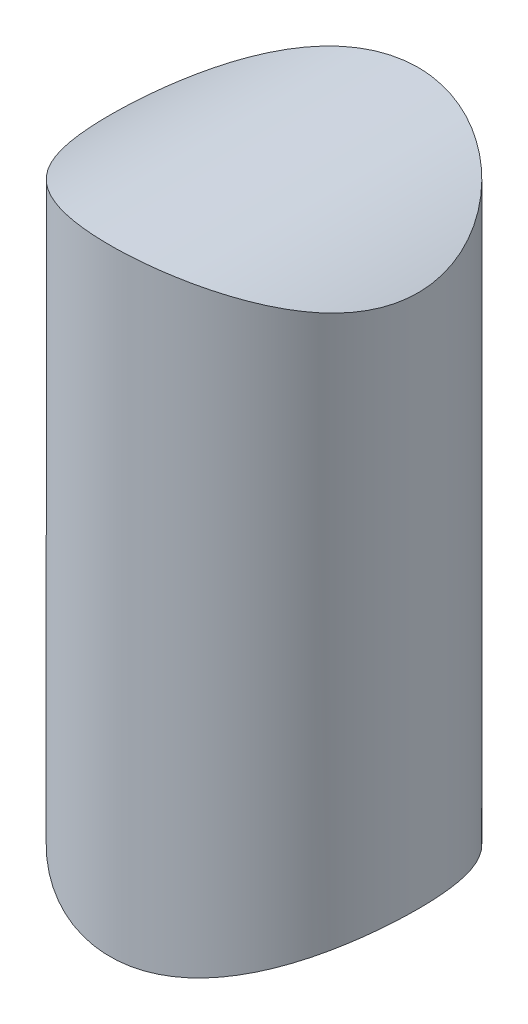
ISO-10303-21;
HEADER;
FILE_DESCRIPTION(('STEP AP214'),'2;1');
FILE_NAME('part.step','',(''),(''),'','','');
FILE_SCHEMA(('AUTOMOTIVE_DESIGN { 1 0 10303 214 1 1 1 1 }'));
ENDSEC;
DATA;
#1=APPLICATION_CONTEXT('core data for automotive mechanical design processes');
#2=APPLICATION_PROTOCOL_DEFINITION('international standard','automotive_design',2000,#1);
#3=PRODUCT_CONTEXT('',#1,'mechanical');
#4=PRODUCT('Part','Part','',(#3));
#5=PRODUCT_RELATED_PRODUCT_CATEGORY('part','',(#4));
#6=PRODUCT_DEFINITION_FORMATION('','',#4);
#7=PRODUCT_DEFINITION_CONTEXT('part definition',#1,'design');
#8=PRODUCT_DEFINITION('design','',#6,#7);
#9=PRODUCT_DEFINITION_SHAPE('','',#8);
#10=(LENGTH_UNIT() NAMED_UNIT(*) SI_UNIT(.MILLI.,.METRE.));
#11=(NAMED_UNIT(*) PLANE_ANGLE_UNIT() SI_UNIT($,.RADIAN.));
#12=(NAMED_UNIT(*) SI_UNIT($,.STERADIAN.) SOLID_ANGLE_UNIT());
#13=UNCERTAINTY_MEASURE_WITH_UNIT(LENGTH_MEASURE(1.E-05),#10,'distance_accuracy_value','');
#14=(GEOMETRIC_REPRESENTATION_CONTEXT(3) GLOBAL_UNCERTAINTY_ASSIGNED_CONTEXT((#13)) GLOBAL_UNIT_ASSIGNED_CONTEXT((#10,
#11,#12)) REPRESENTATION_CONTEXT('',''));
#15=CARTESIAN_POINT('',(0.,0.,0.));
#16=DIRECTION('',(0.,0.,1.));
#17=DIRECTION('',(1.,0.,0.));
#18=AXIS2_PLACEMENT_3D('',#15,#16,#17);
#19=CARTESIAN_POINT('',(0.,20.,0.));
#20=DIRECTION('',(0.,-1.,0.));
#21=DIRECTION('',(0.,0.,-1.));
#22=AXIS2_PLACEMENT_3D('',#19,#20,#21);
#23=CYLINDRICAL_SURFACE('',#22,2.);
#24=CARTESIAN_POINT('',(0.,6.91284167721457,-2.));
#25=CARTESIAN_POINT('',(0.105143925902467,6.91284740911374,-1.99999339536562));
#26=CARTESIAN_POINT('',(0.210413199395125,6.91703185681944,-1.99165985375789));
#27=CARTESIAN_POINT('',(0.417840470537792,6.93335855647143,-1.95869423931692));
#28=CARTESIAN_POINT('',(0.519992173427259,6.94551592063618,-1.93403121400437));
#29=CARTESIAN_POINT('',(0.717867089760898,6.97651608914706,-1.86961238276674));
#30=CARTESIAN_POINT('',(0.813613605878293,6.99533289366382,-1.82991523150406));
#31=CARTESIAN_POINT('',(0.996945233613198,7.03792614689934,-1.73685875727003));
#32=CARTESIAN_POINT('',(1.08453098798012,7.06170220454406,-1.68350051150227));
#33=CARTESIAN_POINT('',(1.25501563552382,7.11371651205333,-1.56096550102943));
#34=CARTESIAN_POINT('',(1.33731042224422,7.14213769466383,-1.49102704152072));
#35=CARTESIAN_POINT('',(1.48955888973396,7.19964227227971,-1.33895704150593));
#36=CARTESIAN_POINT('',(1.55950316621353,7.22872615303388,-1.25681629645512));
#37=CARTESIAN_POINT('',(1.69050400090056,7.28686265326762,-1.07503330095324));
#38=CARTESIAN_POINT('',(1.75045067110327,7.31573793781193,-0.974527803308175));
#39=CARTESIAN_POINT('',(1.85233645378139,7.36712210176816,-0.76326532802757));
#40=CARTESIAN_POINT('',(1.89428842993267,7.38963552507478,-0.652515742554501));
#41=CARTESIAN_POINT('',(1.95626488437718,7.4236843364584,-0.430669789156154));
#42=CARTESIAN_POINT('',(1.97745171416088,7.4357962455403,-0.319991095865211));
#43=CARTESIAN_POINT('',(2.00085398661769,7.44920387824401,-0.0960423244410457));
#44=CARTESIAN_POINT('',(2.00308817674615,7.45051029034881,0.01722508174231));
#45=CARTESIAN_POINT('',(1.98937457434459,7.4426230720696,0.228572048630737));
#46=CARTESIAN_POINT('',(1.97556911907364,7.4346664039743,0.326848062446101));
#47=CARTESIAN_POINT('',(1.93387969811386,7.41131710253756,0.519443818746085));
#48=CARTESIAN_POINT('',(1.9059912477953,7.39592210057904,0.613762290610632));
#49=CARTESIAN_POINT('',(1.83641956077201,7.35909214895975,0.798458265131319));
#50=CARTESIAN_POINT('',(1.79443013423199,7.3375248639346,0.888692797571578));
#51=CARTESIAN_POINT('',(1.698083375336,7.2907735915865,1.06126858518002));
#52=CARTESIAN_POINT('',(1.64372048762493,7.26558798161076,1.14360627120018));
#53=CARTESIAN_POINT('',(1.51613210982558,7.21057851914885,1.30904250548645));
#54=CARTESIAN_POINT('',(1.44138891673856,7.18057147247965,1.39091374715231));
#55=CARTESIAN_POINT('',(1.27911115748275,7.12188921120642,1.5414708371818));
#56=CARTESIAN_POINT('',(1.19157051314857,7.09321463803855,1.61015038406777));
#57=CARTESIAN_POINT('',(1.0010330116637,7.03880193155529,1.73537132205945));
#58=CARTESIAN_POINT('',(0.897507183198816,7.01326199397442,1.79120094489148));
#59=CARTESIAN_POINT('',(0.680932430977592,6.96968405478972,1.88419405808602));
#60=CARTESIAN_POINT('',(0.567891152530551,6.95164009834351,1.92137237003033));
#61=CARTESIAN_POINT('',(0.345532983321404,6.92635500238586,1.97295080743335));
#62=CARTESIAN_POINT('',(0.236683061096652,6.91834291118837,1.98898247149356));
#63=CARTESIAN_POINT('',(0.0175591998987026,6.9113814080325,2.00292946226897));
#64=CARTESIAN_POINT('',(-0.092714039739818,6.9124277027882,2.00085337127894));
#65=CARTESIAN_POINT('',(-0.302465943971974,6.92301783214587,1.97958662316251));
#66=CARTESIAN_POINT('',(-0.402118816099861,6.9318967634512,1.96173493454001));
#67=CARTESIAN_POINT('',(-0.596813784603882,6.95639825091776,1.91152385620976));
#68=CARTESIAN_POINT('',(-0.691855371382174,6.97202155052633,1.87916286709301));
#69=CARTESIAN_POINT('',(-0.877777216899145,7.00915664894281,1.80000306713393));
#70=CARTESIAN_POINT('',(-0.968460794011607,7.03082404182195,1.75281789976743));
#71=CARTESIAN_POINT('',(-1.14092272339854,7.07796219086622,1.64578492870686));
#72=CARTESIAN_POINT('',(-1.22269725955318,7.1034345658758,1.58593173080921));
#73=CARTESIAN_POINT('',(-1.38353537857843,7.15867725049061,1.44847914933857));
#74=CARTESIAN_POINT('',(-1.46154415563805,7.18862398034458,1.3697142631097));
#75=CARTESIAN_POINT('',(-1.60371264223771,7.24759384503817,1.20014969744454));
#76=CARTESIAN_POINT('',(-1.66786277142375,7.27661632921363,1.10934176230416));
#77=CARTESIAN_POINT('',(-1.78341582895804,7.33181783308478,0.912712691654048));
#78=CARTESIAN_POINT('',(-1.8340509916005,7.35779108543335,0.806377467811037));
#79=CARTESIAN_POINT('',(-1.91616565186941,7.40136023133187,0.584979864850067));
#80=CARTESIAN_POINT('',(-1.94766983173403,7.41896691277957,0.469928947066219));
#81=CARTESIAN_POINT('',(-1.98772337493374,7.44161165669853,0.246179554230591));
#82=CARTESIAN_POINT('',(-1.9981859928109,7.44769400791327,0.137931493129517));
#83=CARTESIAN_POINT('',(-2.0013783087524,7.4495345843825,-0.0788941343290498));
#84=CARTESIAN_POINT('',(-1.99411569324648,7.44529728468677,-0.187471537475723));
#85=CARTESIAN_POINT('',(-1.96385225118662,7.42808443619304,-0.390967003066875));
#86=CARTESIAN_POINT('',(-1.94241662868607,7.4159797875614,-0.486200940289479));
#87=CARTESIAN_POINT('',(-1.88635071644882,7.38542135346152,-0.671616238848733));
#88=CARTESIAN_POINT('',(-1.85171618231984,7.3669655258212,-0.761795964184064));
#89=CARTESIAN_POINT('',(-1.76763149060113,7.32427106992386,-0.941249701973074));
#90=CARTESIAN_POINT('',(-1.7173422756314,7.29972722929616,-1.03005580365806));
#91=CARTESIAN_POINT('',(-1.60430194327478,7.24813504451736,-1.19854907236252));
#92=CARTESIAN_POINT('',(-1.54154434248312,7.22108540130236,-1.27823146104222));
#93=CARTESIAN_POINT('',(-1.39640665332275,7.16359521405273,-1.43628396470935));
#94=CARTESIAN_POINT('',(-1.31256884599452,7.13314201108201,-1.51331820470058));
#95=CARTESIAN_POINT('',(-1.13230961246639,7.07528663201596,-1.65252596687054));
#96=CARTESIAN_POINT('',(-1.03588144661039,7.04788610469067,-1.71469147893981));
#97=CARTESIAN_POINT('',(-0.83186319356589,6.99888148588382,-1.82247272542414));
#98=CARTESIAN_POINT('',(-0.72419900755346,6.97731974733591,-1.86796833847294));
#99=CARTESIAN_POINT('',(-0.501484202276173,6.94281485123483,-1.93961633551482));
#100=CARTESIAN_POINT('',(-0.386455599178199,6.92984720995321,-1.96582369361143));
#101=CARTESIAN_POINT('',(-0.22520389298179,6.91893243894501,-1.98779482217148));
#102=CARTESIAN_POINT('',(-0.180323758883129,6.91665437040955,-1.99236528173268));
#103=CARTESIAN_POINT('',(-0.0903034636101829,6.91360773767826,-1.99846933102817));
#104=CARTESIAN_POINT('',(-0.0451632952932568,6.91283921514695,-2.00000283694042));
#105=CARTESIAN_POINT('',(0.,6.91284167721457,-2.));
#106=B_SPLINE_CURVE_WITH_KNOTS('',3,(#24,#25,#26,#27,#28,#29,#30,#31,#32,#33,#34,#35,#36,#37,
#38,#39,#40,#41,#42,#43,#44,#45,#46,#47,#48,#49,#50,#51,#52,#53,#54,#55,#56,#57,#58,#59,#60,#61,
#62,#63,#64,#65,#66,#67,#68,#69,#70,#71,#72,#73,#74,#75,#76,#77,#78,#79,#80,#81,#82,#83,#84,#85,
#86,#87,#88,#89,#90,#91,#92,#93,#94,#95,#96,#97,#98,#99,#100,#101,#102,#103,#104,#105),
.UNSPECIFIED.,.T.,.F.,(4,2,2,2,2,2,2,2,2,2,2,2,2,2,2,2,2,2,2,2,2,2,2,2,2,2,2,2,2,2,2,2,2,2,2,2,
2,2,2,2,4),(0.,0.315248514840585,0.631096299418395,0.945724310984597,1.26032752116314,
1.59396351743618,1.92785247530807,2.28763452861505,2.64715895796562,2.98516024280459,
3.32282714658041,3.62011424818641,3.91749607851357,4.22180480336975,4.52625042520443,
4.86929882667757,5.21251069197373,5.57166044428881,5.93052433824559,6.25966580942691,
6.58865129022952,6.89213813012244,7.19565843261863,7.50785712055797,7.82018901496678,
8.16319221288837,8.50643177230863,8.86629364323451,9.22569023890901,9.55058615006093,
9.87534119729357,10.1691586049771,10.463070575767,10.7767291356057,11.0905512228726,
11.4425048551434,11.7946476676249,12.1492802732705,12.502898172423,12.6383056026783,
12.7737167702213),.UNSPECIFIED.);
#107=CARTESIAN_POINT('',(0.,6.91284167721457,-2.));
#108=VERTEX_POINT('',#107);
#109=EDGE_CURVE('E57',#108,#108,#106,.T.);
#110=ORIENTED_EDGE('',*,*,#109,.F.);
#111=EDGE_LOOP('',(#110));
#112=FACE_BOUND('',#111,.T.);
#113=CARTESIAN_POINT('',(0.,14.9128416772146,-2.));
#114=CARTESIAN_POINT('',(-0.105143925902467,14.9128359453154,-1.99999339536562));
#115=CARTESIAN_POINT('',(-0.210413199395125,14.9086514976097,-1.99165985375789));
#116=CARTESIAN_POINT('',(-0.417840470537792,14.8923247979577,-1.95869423931692));
#117=CARTESIAN_POINT('',(-0.519992173427259,14.880167433793,-1.93403121400437));
#118=CARTESIAN_POINT('',(-0.717867089760898,14.8491672652821,-1.86961238276674));
#119=CARTESIAN_POINT('',(-0.813613605878293,14.8303504607653,-1.82991523150406));
#120=CARTESIAN_POINT('',(-0.996945233613197,14.7877572075298,-1.73685875727003));
#121=CARTESIAN_POINT('',(-1.08453098798012,14.7639811498851,-1.68350051150227));
#122=CARTESIAN_POINT('',(-1.25501563552382,14.7119668423758,-1.56096550102943));
#123=CARTESIAN_POINT('',(-1.33731042224422,14.6835456597653,-1.49102704152072));
#124=CARTESIAN_POINT('',(-1.48955888973396,14.6260410821494,-1.33895704150593));
#125=CARTESIAN_POINT('',(-1.55950316621353,14.5969572013953,-1.25681629645512));
#126=CARTESIAN_POINT('',(-1.69050400090056,14.5388207011615,-1.07503330095324));
#127=CARTESIAN_POINT('',(-1.75045067110327,14.5099454166172,-0.974527803308174));
#128=CARTESIAN_POINT('',(-1.85233645378139,14.458561252661,-0.76326532802757));
#129=CARTESIAN_POINT('',(-1.89428842993267,14.4360478293544,-0.652515742554501));
#130=CARTESIAN_POINT('',(-1.95626488437718,14.4019990179707,-0.430669789156155));
#131=CARTESIAN_POINT('',(-1.97745171416088,14.3898871088888,-0.319991095865212));
#132=CARTESIAN_POINT('',(-2.00085398661769,14.3764794761851,-0.0960423244410465));
#133=CARTESIAN_POINT('',(-2.00308817674615,14.3751730640803,0.0172250817423093));
#134=CARTESIAN_POINT('',(-1.98937457434459,14.3830602823595,0.228572048630736));
#135=CARTESIAN_POINT('',(-1.97556911907364,14.3910169504548,0.3268480624461));
#136=CARTESIAN_POINT('',(-1.93387969811386,14.4143662518916,0.519443818746084));
#137=CARTESIAN_POINT('',(-1.9059912477953,14.4297612538501,0.613762290610631));
#138=CARTESIAN_POINT('',(-1.83641956077201,14.4665912054694,0.798458265131318));
#139=CARTESIAN_POINT('',(-1.79443013423199,14.4881584904945,0.888692797571577));
#140=CARTESIAN_POINT('',(-1.698083375336,14.5349097628426,1.06126858518002));
#141=CARTESIAN_POINT('',(-1.64372048762493,14.5600953728184,1.14360627120018));
#142=CARTESIAN_POINT('',(-1.51613210982558,14.6151048352803,1.30904250548645));
#143=CARTESIAN_POINT('',(-1.44138891673856,14.6451118819495,1.39091374715231));
#144=CARTESIAN_POINT('',(-1.27911115748275,14.7037941432227,1.5414708371818));
#145=CARTESIAN_POINT('',(-1.19157051314857,14.7324687163906,1.61015038406777));
#146=CARTESIAN_POINT('',(-1.0010330116637,14.7868814228738,1.73537132205945));
#147=CARTESIAN_POINT('',(-0.897507183198817,14.8124213604547,1.79120094489148));
#148=CARTESIAN_POINT('',(-0.680932430977593,14.8559992996394,1.88419405808602));
#149=CARTESIAN_POINT('',(-0.567891152530552,14.8740432560856,1.92137237003033));
#150=CARTESIAN_POINT('',(-0.345532983321404,14.8993283520433,1.97295080743335));
#151=CARTESIAN_POINT('',(-0.236683061096653,14.9073404432408,1.98898247149356));
#152=CARTESIAN_POINT('',(-0.0175591998987035,14.9143019463966,2.00292946226897));
#153=CARTESIAN_POINT('',(0.0927140397398173,14.9132556516409,2.00085337127894));
#154=CARTESIAN_POINT('',(0.302465943971974,14.9026655222833,1.97958662316251));
#155=CARTESIAN_POINT('',(0.40211881609986,14.8937865909779,1.96173493454001));
#156=CARTESIAN_POINT('',(0.596813784603882,14.8692851035114,1.91152385620976));
#157=CARTESIAN_POINT('',(0.691855371382174,14.8536618039028,1.87916286709301));
#158=CARTESIAN_POINT('',(0.877777216899145,14.8165267054863,1.80000306713393));
#159=CARTESIAN_POINT('',(0.968460794011606,14.7948593126072,1.75281789976743));
#160=CARTESIAN_POINT('',(1.14092272339854,14.7477211635629,1.64578492870686));
#161=CARTESIAN_POINT('',(1.22269725955318,14.7222487885533,1.58593173080921));
#162=CARTESIAN_POINT('',(1.38353537857843,14.6670061039385,1.44847914933857));
#163=CARTESIAN_POINT('',(1.46154415563805,14.6370593740846,1.3697142631097));
#164=CARTESIAN_POINT('',(1.60371264223771,14.578089509391,1.20014969744454));
#165=CARTESIAN_POINT('',(1.66786277142375,14.5490670252155,1.10934176230416));
#166=CARTESIAN_POINT('',(1.78341582895804,14.4938655213444,0.912712691654048));
#167=CARTESIAN_POINT('',(1.8340509916005,14.4678922689958,0.806377467811036));
#168=CARTESIAN_POINT('',(1.91616565186941,14.4243231230973,0.584979864850067));
#169=CARTESIAN_POINT('',(1.94766983173403,14.4067164416496,0.469928947066219));
#170=CARTESIAN_POINT('',(1.98772337493374,14.3840716977306,0.246179554230591));
#171=CARTESIAN_POINT('',(1.9981859928109,14.3779893465159,0.137931493129516));
#172=CARTESIAN_POINT('',(2.0013783087524,14.3761487700466,-0.07889413432905));
#173=CARTESIAN_POINT('',(1.99411569324648,14.3803860697424,-0.187471537475723));
#174=CARTESIAN_POINT('',(1.96385225118662,14.3975989182361,-0.390967003066874));
#175=CARTESIAN_POINT('',(1.94241662868607,14.4097035668677,-0.486200940289479));
#176=CARTESIAN_POINT('',(1.88635071644882,14.4402620009676,-0.671616238848733));
#177=CARTESIAN_POINT('',(1.85171618231984,14.4587178286079,-0.761795964184063));
#178=CARTESIAN_POINT('',(1.76763149060113,14.5014122845053,-0.941249701973073));
#179=CARTESIAN_POINT('',(1.7173422756314,14.525956125133,-1.03005580365806));
#180=CARTESIAN_POINT('',(1.60430194327478,14.5775483099118,-1.19854907236252));
#181=CARTESIAN_POINT('',(1.54154434248312,14.6045979531268,-1.27823146104222));
#182=CARTESIAN_POINT('',(1.39640665332275,14.6620881403764,-1.43628396470935));
#183=CARTESIAN_POINT('',(1.31256884599452,14.6925413433471,-1.51331820470058));
#184=CARTESIAN_POINT('',(1.13230961246639,14.7503967224132,-1.65252596687054));
#185=CARTESIAN_POINT('',(1.03588144661039,14.7777972497385,-1.71469147893981));
#186=CARTESIAN_POINT('',(0.831863193565891,14.8268018685453,-1.82247272542414));
#187=CARTESIAN_POINT('',(0.724199007553461,14.8483636070932,-1.86796833847293));
#188=CARTESIAN_POINT('',(0.501484202276173,14.8828685031943,-1.93961633551482));
#189=CARTESIAN_POINT('',(0.3864555991782,14.8958361444759,-1.96582369361143));
#190=CARTESIAN_POINT('',(0.225203892981791,14.9067509154841,-1.98779482217148));
#191=CARTESIAN_POINT('',(0.18032375888313,14.9090289840196,-1.99236528173268));
#192=CARTESIAN_POINT('',(0.0903034636101834,14.9120756167509,-1.99846933102817));
#193=CARTESIAN_POINT('',(0.045163295293257,14.9128441392822,-2.00000283694042));
#194=CARTESIAN_POINT('',(0.,14.9128416772146,-2.));
#195=B_SPLINE_CURVE_WITH_KNOTS('',3,(#113,#114,#115,#116,#117,#118,#119,#120,#121,#122,#123,
#124,#125,#126,#127,#128,#129,#130,#131,#132,#133,#134,#135,#136,#137,#138,#139,#140,#141,#142,
#143,#144,#145,#146,#147,#148,#149,#150,#151,#152,#153,#154,#155,#156,#157,#158,#159,#160,#161,
#162,#163,#164,#165,#166,#167,#168,#169,#170,#171,#172,#173,#174,#175,#176,#177,#178,#179,#180,
#181,#182,#183,#184,#185,#186,#187,#188,#189,#190,#191,#192,#193,#194),.UNSPECIFIED.,.T.,.F.,(4,
2,2,2,2,2,2,2,2,2,2,2,2,2,2,2,2,2,2,2,2,2,2,2,2,2,2,2,2,2,2,2,2,2,2,2,2,2,2,2,4),(0.,
0.315248514840585,0.631096299418395,0.945724310984597,1.26032752116314,1.59396351743618,
1.92785247530807,2.28763452861505,2.64715895796562,2.98516024280459,3.32282714658041,
3.62011424818641,3.91749607851357,4.22180480336975,4.52625042520444,4.86929882667757,
5.21251069197372,5.57166044428881,5.93052433824559,6.25966580942691,6.58865129022952,
6.89213813012244,7.19565843261863,7.50785712055797,7.82018901496678,8.16319221288837,
8.50643177230863,8.86629364323451,9.22569023890901,9.55058615006093,9.87534119729357,
10.1691586049771,10.463070575767,10.7767291356057,11.0905512228726,11.4425048551434,
11.7946476676249,12.1492802732705,12.502898172423,12.6383056026783,12.7737167702213),.UNSPECIFIED.);
#196=CARTESIAN_POINT('',(0.,14.9128416772146,-2.));
#197=VERTEX_POINT('',#196);
#198=EDGE_CURVE('E12',#197,#197,#195,.T.);
#199=ORIENTED_EDGE('',*,*,#198,.F.);
#200=EDGE_LOOP('',(#199));
#201=FACE_BOUND('',#200,.T.);
#202=ADVANCED_FACE('F47',(#112,#201),#23,.T.);
#203=CARTESIAN_POINT('',(0.,10.9128416772146,-10.));
#204=DIRECTION('',(0.,0.,1.));
#205=DIRECTION('',(1.,0.,0.));
#206=AXIS2_PLACEMENT_3D('',#203,#204,#205);
#207=CYLINDRICAL_SURFACE('',#206,4.);
#208=ORIENTED_EDGE('',*,*,#109,.T.);
#209=EDGE_LOOP('',(#208));
#210=FACE_BOUND('',#209,.T.);
#211=ADVANCED_FACE('F69',(#210),#207,.T.);
#212=ORIENTED_EDGE('',*,*,#198,.T.);
#213=EDGE_LOOP('',(#212));
#214=FACE_BOUND('',#213,.T.);
#215=ADVANCED_FACE('F66',(#214),#207,.T.);
#216=CLOSED_SHELL('',(#202,#211,#215));
#217=MANIFOLD_SOLID_BREP('B2',#216);
#218=ADVANCED_BREP_SHAPE_REPRESENTATION('',(#18,#217),#14);
#219=SHAPE_DEFINITION_REPRESENTATION(#9,#218);
ENDSEC;
END-ISO-10303-21;
